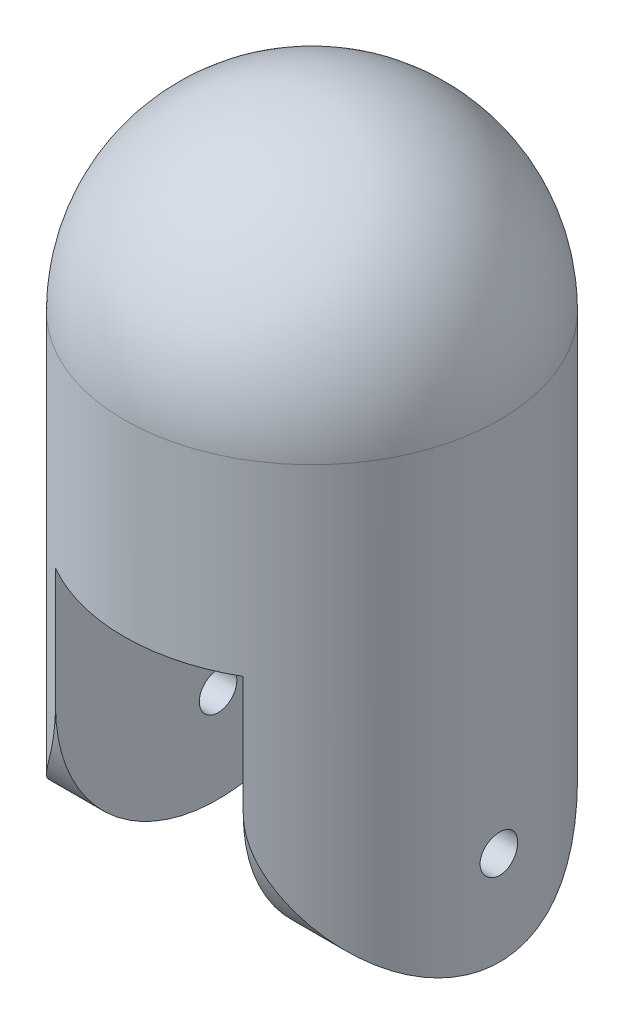
ISO-10303-21;
HEADER;
FILE_DESCRIPTION(('STEP AP214'),'2;1');
FILE_NAME('part.step','',(''),(''),'','','');
FILE_SCHEMA(('AUTOMOTIVE_DESIGN { 1 0 10303 214 1 1 1 1 }'));
ENDSEC;
DATA;
#1=APPLICATION_CONTEXT('core data for automotive mechanical design processes');
#2=APPLICATION_PROTOCOL_DEFINITION('international standard','automotive_design',2000,#1);
#3=PRODUCT_CONTEXT('',#1,'mechanical');
#4=PRODUCT('Part','Part','',(#3));
#5=PRODUCT_RELATED_PRODUCT_CATEGORY('part','',(#4));
#6=PRODUCT_DEFINITION_FORMATION('','',#4);
#7=PRODUCT_DEFINITION_CONTEXT('part definition',#1,'design');
#8=PRODUCT_DEFINITION('design','',#6,#7);
#9=PRODUCT_DEFINITION_SHAPE('','',#8);
#10=(LENGTH_UNIT() NAMED_UNIT(*) SI_UNIT(.MILLI.,.METRE.));
#11=(NAMED_UNIT(*) PLANE_ANGLE_UNIT() SI_UNIT($,.RADIAN.));
#12=(NAMED_UNIT(*) SI_UNIT($,.STERADIAN.) SOLID_ANGLE_UNIT());
#13=UNCERTAINTY_MEASURE_WITH_UNIT(LENGTH_MEASURE(1.E-05),#10,'distance_accuracy_value','');
#14=(GEOMETRIC_REPRESENTATION_CONTEXT(3) GLOBAL_UNCERTAINTY_ASSIGNED_CONTEXT((#13)) GLOBAL_UNIT_ASSIGNED_CONTEXT((#10,
#11,#12)) REPRESENTATION_CONTEXT('',''));
#15=CARTESIAN_POINT('',(0.,0.,0.));
#16=DIRECTION('',(0.,0.,1.));
#17=DIRECTION('',(1.,0.,0.));
#18=AXIS2_PLACEMENT_3D('',#15,#16,#17);
#19=CARTESIAN_POINT('',(0.,-5.,0.));
#20=DIRECTION('',(0.,1.,0.));
#21=DIRECTION('',(0.,0.,1.));
#22=AXIS2_PLACEMENT_3D('',#19,#20,#21);
#23=CYLINDRICAL_SURFACE('',#22,5.);
#24=CARTESIAN_POINT('',(-5.,-9.499999984,0.));
#25=CARTESIAN_POINT('',(-4.99999967760383,-9.50000119695261,-0.0280101777873308));
#26=CARTESIAN_POINT('',(-4.99976212796589,-9.50236161852776,-0.0560388743672643));
#27=CARTESIAN_POINT('',(-4.9988373378997,-9.51174216952627,-0.111319202789992));
#28=CARTESIAN_POINT('',(-4.99814960205238,-9.51876743261788,-0.138569943992334));
#29=CARTESIAN_POINT('',(-4.99640207258643,-9.53727110549382,-0.191485843816181));
#30=CARTESIAN_POINT('',(-4.99534250370722,-9.54874682581881,-0.217151949212178));
#31=CARTESIAN_POINT('',(-4.99296978652423,-9.57582044038433,-0.266188088942592));
#32=CARTESIAN_POINT('',(-4.99165668865977,-9.59141751491283,-0.289558578594351));
#33=CARTESIAN_POINT('',(-4.98891872100106,-9.62635133685349,-0.333429785940652));
#34=CARTESIAN_POINT('',(-4.98749350707263,-9.64569988833981,-0.353921083676557));
#35=CARTESIAN_POINT('',(-4.98469478355547,-9.68756225710439,-0.391371273173411));
#36=CARTESIAN_POINT('',(-4.98332127636073,-9.71007622071172,-0.408330001542547));
#37=CARTESIAN_POINT('',(-4.98077795653672,-9.75768925805425,-0.438266999185338));
#38=CARTESIAN_POINT('',(-4.97960858225206,-9.78279371506465,-0.451236747109148));
#39=CARTESIAN_POINT('',(-4.97761018630142,-9.83483778763942,-0.472773207447989));
#40=CARTESIAN_POINT('',(-4.97678115622644,-9.86177735784383,-0.481340028648987));
#41=CARTESIAN_POINT('',(-4.97556041880156,-9.9166308977411,-0.49379953655576));
#42=CARTESIAN_POINT('',(-4.97516725040178,-9.94454128662517,-0.497707842382945));
#43=CARTESIAN_POINT('',(-4.97485821369378,-10.0006244316877,-0.500787658550239));
#44=CARTESIAN_POINT('',(-4.9749423328401,-10.0287971809506,-0.499959293393249));
#45=CARTESIAN_POINT('',(-4.97557703293132,-10.0844976575086,-0.493602155885742));
#46=CARTESIAN_POINT('',(-4.97612592142474,-10.1120273531991,-0.488090437649585));
#47=CARTESIAN_POINT('',(-4.97762567000382,-10.1657689868394,-0.472549587176829));
#48=CARTESIAN_POINT('',(-4.97857653551958,-10.1919809069827,-0.462520393915724));
#49=CARTESIAN_POINT('',(-4.98077504602728,-10.2423968013225,-0.438210460966773));
#50=CARTESIAN_POINT('',(-4.98202321838719,-10.2665971031888,-0.423922154937144));
#51=CARTESIAN_POINT('',(-4.98467525767972,-10.3122626173566,-0.391505026234831));
#52=CARTESIAN_POINT('',(-4.98607912916871,-10.333727749577,-0.373376091156388));
#53=CARTESIAN_POINT('',(-4.98889192584952,-10.3734127088561,-0.333697066939875));
#54=CARTESIAN_POINT('',(-4.99030084603988,-10.3916178133905,-0.312132249473895));
#55=CARTESIAN_POINT('',(-4.99295914493806,-10.4241518299591,-0.266244749455726));
#56=CARTESIAN_POINT('',(-4.99420852346701,-10.4384807376475,-0.241922063811553));
#57=CARTESIAN_POINT('',(-4.99640737810265,-10.4628550249185,-0.191199059038273));
#58=CARTESIAN_POINT('',(-4.9973568019022,-10.4728996575013,-0.164798378542757));
#59=CARTESIAN_POINT('',(-4.9988482371317,-10.4884094739589,-0.110673612279845));
#60=CARTESIAN_POINT('',(-4.99939026074511,-10.4938747947803,-0.0829495661145428));
#61=CARTESIAN_POINT('',(-5.00000425834139,-10.5000521698624,-0.0270925504879768));
#62=CARTESIAN_POINT('',(-5.00007824134368,-10.5007845401513,0.00103815100607934));
#63=CARTESIAN_POINT('',(-4.99975320876917,-10.4975285844113,0.0570218983941149));
#64=CARTESIAN_POINT('',(-4.99935419958256,-10.4935403221585,0.0848749480340737));
#65=CARTESIAN_POINT('',(-4.99812930757904,-10.4809731677218,0.13945410777766));
#66=CARTESIAN_POINT('',(-4.99730430942121,-10.4724037879305,0.166182429695454));
#67=CARTESIAN_POINT('',(-4.99531999400854,-10.4509274274884,0.217822167543443));
#68=CARTESIAN_POINT('',(-4.99416066925831,-10.438020349588,0.242733542723093));
#69=CARTESIAN_POINT('',(-4.99163237612333,-10.4081845938476,0.290124099246603));
#70=CARTESIAN_POINT('',(-4.99026271740098,-10.3912425681866,0.312594839757218));
#71=CARTESIAN_POINT('',(-4.9874696635526,-10.3538369776062,0.354380822884648));
#72=CARTESIAN_POINT('',(-4.98604626707854,-10.3333733242988,0.373695986277013));
#73=CARTESIAN_POINT('',(-4.98330011964043,-10.2894167221159,0.408693067934103));
#74=CARTESIAN_POINT('',(-4.98197774954588,-10.2659131304273,0.424361652843407));
#75=CARTESIAN_POINT('',(-4.97958916100022,-10.2165963270549,0.451529143768985));
#76=CARTESIAN_POINT('',(-4.97852293904639,-10.1907831469605,0.463028106804347));
#77=CARTESIAN_POINT('',(-4.9767697366816,-10.1376256348755,0.481507619734649));
#78=CARTESIAN_POINT('',(-4.97608209071493,-10.1102840836903,0.48849610303374));
#79=CARTESIAN_POINT('',(-4.97516182481883,-10.0548084029826,0.497782019513339));
#80=CARTESIAN_POINT('',(-4.97492919183919,-10.0266742962148,0.500079587233779));
#81=CARTESIAN_POINT('',(-4.97494556392478,-9.97054465509411,0.499916585287808));
#82=CARTESIAN_POINT('',(-4.97519244883662,-9.94254905694121,0.497476960783508));
#83=CARTESIAN_POINT('',(-4.97613551790737,-9.88736753804265,0.487952742191796));
#84=CARTESIAN_POINT('',(-4.97683170257167,-9.86018161820781,0.480868142879295));
#85=CARTESIAN_POINT('',(-4.97859433992977,-9.8073913195536,0.462260858083581));
#86=CARTESIAN_POINT('',(-4.97966074138294,-9.78178672244534,0.450738786753755));
#87=CARTESIAN_POINT('',(-4.98204375802884,-9.73287154586025,0.42358579120604));
#88=CARTESIAN_POINT('',(-4.9833603718204,-9.70956095353834,0.40795488999697));
#89=CARTESIAN_POINT('',(-4.98610243513916,-9.6657881522995,0.372949290325798));
#90=CARTESIAN_POINT('',(-4.98752832281589,-9.64533845068704,0.353558986021871));
#91=CARTESIAN_POINT('',(-4.99032427300597,-9.60797387130152,0.31161585987346));
#92=CARTESIAN_POINT('',(-4.99169432206538,-9.59105984141843,0.289062281605575));
#93=CARTESIAN_POINT('',(-4.99422780996069,-9.56121325918389,0.241370725124351));
#94=CARTESIAN_POINT('',(-4.99539071982482,-9.54829084020802,0.216226381918243));
#95=CARTESIAN_POINT('',(-4.99737314607036,-9.5268687735485,0.164129145135606));
#96=CARTESIAN_POINT('',(-4.99819304942341,-9.51836413919394,0.137178329637511));
#97=CARTESIAN_POINT('',(-4.99919106881191,-9.50813967576056,0.0917291339200233));
#98=CARTESIAN_POINT('',(-4.99949300342359,-9.50509146203848,0.0735212790016357));
#99=CARTESIAN_POINT('',(-4.99989757474674,-9.501021221005,0.0368782917031077));
#100=CARTESIAN_POINT('',(-5.00000021228013,-9.49999918533747,0.01844316026059));
#101=CARTESIAN_POINT('',(-5.,-9.499999984,0.));
#102=B_SPLINE_CURVE_WITH_KNOTS('',3,(#24,#25,#26,#27,#28,#29,#30,#31,#32,#33,#34,#35,#36,#37,
#38,#39,#40,#41,#42,#43,#44,#45,#46,#47,#48,#49,#50,#51,#52,#53,#54,#55,#56,#57,#58,#59,#60,#61,
#62,#63,#64,#65,#66,#67,#68,#69,#70,#71,#72,#73,#74,#75,#76,#77,#78,#79,#80,#81,#82,#83,#84,#85,
#86,#87,#88,#89,#90,#91,#92,#93,#94,#95,#96,#97,#98,#99,#100,#101),.UNSPECIFIED.,.T.,.F.,(4,2,2,
2,2,2,2,2,2,2,2,2,2,2,2,2,2,2,2,2,2,2,2,2,2,2,2,2,2,2,2,2,2,2,2,2,2,2,4),(0.,0.0839631858065279,
0.168018926764722,0.252023950885486,0.336012279482916,0.420269297700153,0.504530212189535,
0.58896989616187,0.673407493727842,0.757561184428689,0.841712663168769,0.925559016753212,
1.0094065030137,1.09340384174215,1.17740363920568,1.26177371123901,1.34614387786477,
1.43052874914338,1.51491109676199,1.59893099409825,1.68294975632974,1.76679473286328,
1.85064158929701,1.93476976547761,2.01890005346993,2.10333328517581,2.18776536222363,
2.27204852551201,2.35632927144491,2.44023822438076,2.52414727170516,2.60804471005106,
2.69194167859412,2.77619467573449,2.86046785447851,2.94495324914103,3.02934307069971,
3.08462843482523,3.13991357094885),.UNSPECIFIED.);
#103=CARTESIAN_POINT('',(-5.,-9.499999984,0.));
#104=VERTEX_POINT('',#103);
#105=EDGE_CURVE('E150',#104,#104,#102,.T.);
#106=ORIENTED_EDGE('',*,*,#105,.F.);
#107=EDGE_LOOP('',(#106));
#108=FACE_BOUND('',#107,.T.);
#109=CARTESIAN_POINT('',(5.,-9.49999998400001,0.));
#110=CARTESIAN_POINT('',(4.99999967760383,-9.50000119694785,0.028010177787309));
#111=CARTESIAN_POINT('',(4.99976212796589,-9.50236161851822,0.0560388743676223));
#112=CARTESIAN_POINT('',(4.99883733789966,-9.5117421695073,0.111319202791904));
#113=CARTESIAN_POINT('',(4.99814960205231,-9.51876743259426,0.13856994399542));
#114=CARTESIAN_POINT('',(4.9964020725862,-9.53727110546116,0.191485843822376));
#115=CARTESIAN_POINT('',(4.99534250370688,-9.54874682578176,0.217151949220307));
#116=CARTESIAN_POINT('',(4.99296978652356,-9.57582044033887,0.266188088955293));
#117=CARTESIAN_POINT('',(4.9916566886589,-9.59141751486337,0.289558578609689));
#118=CARTESIAN_POINT('',(4.98891872099965,-9.62635133679649,0.333429785961909));
#119=CARTESIAN_POINT('',(4.9874935070709,-9.64569988827927,0.353921083701098));
#120=CARTESIAN_POINT('',(4.98469478355299,-9.68756225703739,0.391371273205068));
#121=CARTESIAN_POINT('',(4.98332127635783,-9.71007622064179,0.408330001578035));
#122=CARTESIAN_POINT('',(4.9807779565329,-9.75768925797917,0.438266999228974));
#123=CARTESIAN_POINT('',(4.97960858224772,-9.78279371498737,0.451236747157092));
#124=CARTESIAN_POINT('',(4.97761018629602,-9.8348377875585,0.472773207504861));
#125=CARTESIAN_POINT('',(4.97678115622049,-9.86177735776146,0.481340028710478));
#126=CARTESIAN_POINT('',(4.97556041879453,-9.91663089765667,0.49379953662665));
#127=CARTESIAN_POINT('',(4.97516725039421,-9.94454128654012,0.497707842458612));
#128=CARTESIAN_POINT('',(4.9748582136852,-10.0006244316022,0.50078765863549));
#129=CARTESIAN_POINT('',(4.97494233283105,-10.0287971808653,0.499959293483306));
#130=CARTESIAN_POINT('',(4.97557703292144,-10.0844976574244,0.49360215598529));
#131=CARTESIAN_POINT('',(4.97612592141451,-10.1120273531158,0.488090437753832));
#132=CARTESIAN_POINT('',(4.97762566999304,-10.1657689867588,0.472549587290256));
#133=CARTESIAN_POINT('',(4.97857653550862,-10.1919809069038,0.462520394033632));
#134=CARTESIAN_POINT('',(4.98077504601613,-10.2423968012476,0.438210461093338));
#135=CARTESIAN_POINT('',(4.98202321837605,-10.2665971031162,0.423922155067895));
#136=CARTESIAN_POINT('',(4.98467525766882,-10.3122626172895,0.391505026373519));
#137=CARTESIAN_POINT('',(4.98607912915803,-10.3337277495129,0.373376091298826));
#138=CARTESIAN_POINT('',(4.98889192583951,-10.3734127087987,0.333697067089251));
#139=CARTESIAN_POINT('',(4.99030084603033,-10.3916178133367,0.312132249626447));
#140=CARTESIAN_POINT('',(4.99295914492961,-10.4241518299132,0.266244749613979));
#141=CARTESIAN_POINT('',(4.99420852345921,-10.4384807376057,0.241922063972332));
#142=CARTESIAN_POINT('',(4.99640737809632,-10.4628550248856,0.191199059203264));
#143=CARTESIAN_POINT('',(4.99735680189669,-10.4728996574728,0.164798378709426));
#144=CARTESIAN_POINT('',(4.99884823712795,-10.4884094739398,0.110673612449066));
#145=CARTESIAN_POINT('',(4.99939026074229,-10.493874794766,0.0829495662846378));
#146=CARTESIAN_POINT('',(5.00000425834046,-10.5000521698578,0.0270925506589711));
#147=CARTESIAN_POINT('',(5.00007824134372,-10.5007845401515,-0.00103815083505638));
#148=CARTESIAN_POINT('',(4.99975320877112,-10.497528584421,-0.0570218982238571));
#149=CARTESIAN_POINT('',(4.99935419958544,-10.493540322173,-0.0848749478646096));
#150=CARTESIAN_POINT('',(4.99812930758371,-10.4809731677456,-0.139454107610455));
#151=CARTESIAN_POINT('',(4.99730430942673,-10.4724037879588,-0.166182429529717));
#152=CARTESIAN_POINT('',(4.99531999401562,-10.4509274275255,-0.217822167381385));
#153=CARTESIAN_POINT('',(4.99416066926609,-10.4380203496294,-0.242733542563244));
#154=CARTESIAN_POINT('',(4.99163237613234,-10.4081845938972,-0.290124099091779));
#155=CARTESIAN_POINT('',(4.99026271741051,-10.39124256824,-0.312594839605218));
#156=CARTESIAN_POINT('',(4.98746966356297,-10.3538369776669,-0.354380822738911));
#157=CARTESIAN_POINT('',(4.98604626708922,-10.3333733243628,-0.373695986134715));
#158=CARTESIAN_POINT('',(4.9833001196515,-10.2894167221861,-0.408693067799255));
#159=CARTESIAN_POINT('',(4.98197774955703,-10.2659131305002,-0.424361652712564));
#160=CARTESIAN_POINT('',(4.97958916101133,-10.2165963271326,-0.451529143646564));
#161=CARTESIAN_POINT('',(4.97852293905738,-10.1907831470402,-0.463028106686343));
#162=CARTESIAN_POINT('',(4.97676973669214,-10.1376256349584,-0.481507619625801));
#163=CARTESIAN_POINT('',(4.97608209072515,-10.1102840837744,-0.488496102929612));
#164=CARTESIAN_POINT('',(4.97516182482829,-10.0548084030682,-0.49778201941877));
#165=CARTESIAN_POINT('',(4.97492919184821,-10.0266742963007,-0.500079587144049));
#166=CARTESIAN_POINT('',(4.97494556393283,-9.97054465517982,-0.499916585207711));
#167=CARTESIAN_POINT('',(4.97519244884415,-9.94254905702642,-0.497476960708201));
#168=CARTESIAN_POINT('',(4.97613551791382,-9.88736753812603,-0.487952742125896));
#169=CARTESIAN_POINT('',(4.97683170257759,-9.86018161828989,-0.480868142818013));
#170=CARTESIAN_POINT('',(4.97859433993462,-9.80739131963239,-0.46226085803126));
#171=CARTESIAN_POINT('',(4.97966074138727,-9.78178672252216,-0.45073878670579));
#172=CARTESIAN_POINT('',(4.9820437580322,-9.7328715459324,-0.423585791166389));
#173=CARTESIAN_POINT('',(4.98336037182332,-9.70956095360782,-0.407954889961277));
#174=CARTESIAN_POINT('',(4.98610243514126,-9.66578815236302,-0.372949290297571));
#175=CARTESIAN_POINT('',(4.98752832281763,-9.64533845074729,-0.353558985997156));
#176=CARTESIAN_POINT('',(4.9903242730071,-9.60797387135468,-0.311615859855182));
#177=CARTESIAN_POINT('',(4.99169432206625,-9.59105984146777,-0.289062281590221));
#178=CARTESIAN_POINT('',(4.99422780996117,-9.56121325922513,-0.241370725114151));
#179=CARTESIAN_POINT('',(4.99539071982516,-9.54829084024497,-0.216226381910268));
#180=CARTESIAN_POINT('',(4.99737314607049,-9.52686877357656,-0.16412914513133));
#181=CARTESIAN_POINT('',(4.99819304942348,-9.5183641392174,-0.137178329634712));
#182=CARTESIAN_POINT('',(4.99919106881193,-9.50813967577624,-0.0917291339189367));
#183=CARTESIAN_POINT('',(4.99949300342359,-9.50509146205104,-0.0735212790010095));
#184=CARTESIAN_POINT('',(4.99989757474674,-9.50102122101129,-0.0368782917030553));
#185=CARTESIAN_POINT('',(5.00000021228013,-9.49999918534062,-0.0184431602606509));
#186=CARTESIAN_POINT('',(5.,-9.49999998400001,0.));
#187=B_SPLINE_CURVE_WITH_KNOTS('',3,(#109,#110,#111,#112,#113,#114,#115,#116,#117,#118,#119,
#120,#121,#122,#123,#124,#125,#126,#127,#128,#129,#130,#131,#132,#133,#134,#135,#136,#137,#138,
#139,#140,#141,#142,#143,#144,#145,#146,#147,#148,#149,#150,#151,#152,#153,#154,#155,#156,#157,
#158,#159,#160,#161,#162,#163,#164,#165,#166,#167,#168,#169,#170,#171,#172,#173,#174,#175,#176,
#177,#178,#179,#180,#181,#182,#183,#184,#185,#186),.UNSPECIFIED.,.T.,.F.,(4,2,2,2,2,2,2,2,2,2,2,
2,2,2,2,2,2,2,2,2,2,2,2,2,2,2,2,2,2,2,2,2,2,2,2,2,2,2,4),(0.,0.0839631858064614,
0.168018926764588,0.252023950885285,0.336012279482648,0.420269297699834,0.504530212189164,
0.588969896161619,0.673407493727713,0.757561184428719,0.84171266316896,0.925559016753315,
1.00940650301372,1.09340384174188,1.17740363920514,1.26177371123836,1.34614387786403,
1.4305287491429,1.51491109676176,1.59893099409831,1.68294975633009,1.76679473286358,
1.85064158929725,1.93476976547752,2.0189000534695,2.10333328517521,2.18776536222286,
2.27204852551143,2.35632927144451,2.44023822438061,2.52414727170527,2.60804471005117,
2.69194167859423,2.77619467573442,2.86046785447826,2.94495324914071,3.02934307069931,
3.08462843482502,3.13991357094882),.UNSPECIFIED.);
#188=CARTESIAN_POINT('',(5.,-9.49999998400001,0.));
#189=VERTEX_POINT('',#188);
#190=EDGE_CURVE('E11',#189,#189,#187,.T.);
#191=ORIENTED_EDGE('',*,*,#190,.F.);
#192=EDGE_LOOP('',(#191));
#193=FACE_BOUND('',#192,.T.);
#194=CARTESIAN_POINT('',(0.,0.,0.));
#195=DIRECTION('',(0.,1.,0.));
#196=DIRECTION('',(0.,0.,1.));
#197=AXIS2_PLACEMENT_3D('',#194,#195,#196);
#198=CIRCLE('',#197,5.);
#199=CARTESIAN_POINT('',(0.,0.,5.));
#200=VERTEX_POINT('',#199);
#201=EDGE_CURVE('E112',#200,#200,#198,.T.);
#202=ORIENTED_EDGE('',*,*,#201,.F.);
#203=EDGE_LOOP('',(#202));
#204=FACE_BOUND('',#203,.T.);
#205=DIRECTION('',(0.,1.,0.));
#206=VECTOR('',#205,1.);
#207=CARTESIAN_POINT('',(2.5,-12.5,4.33012701892219));
#208=LINE('',#207,#206);
#209=CARTESIAN_POINT('',(2.5,-8.16987298,4.33012701892219));
#210=VERTEX_POINT('',#209);
#211=CARTESIAN_POINT('',(2.5,-5.,4.33012701892219));
#212=VERTEX_POINT('',#211);
#213=EDGE_CURVE('E87',#210,#212,#208,.T.);
#214=ORIENTED_EDGE('',*,*,#213,.F.);
#215=CARTESIAN_POINT('',(2.49999999906659,-8.16987298,4.3301270194611));
#216=CARTESIAN_POINT('',(2.49994047676743,-8.24194984829454,4.33014457822797));
#217=CARTESIAN_POINT('',(2.50311561937887,-8.31398779937124,4.32832823331433));
#218=CARTESIAN_POINT('',(2.51546535484218,-8.45721545042402,4.32117145374343));
#219=CARTESIAN_POINT('',(2.52462657068261,-8.52840668222383,4.31583887652921));
#220=CARTESIAN_POINT('',(2.5482891498408,-8.66835404549736,4.30190598866757));
#221=CARTESIAN_POINT('',(2.56270159276735,-8.7371309423001,4.29336001828221));
#222=CARTESIAN_POINT('',(2.59618858709095,-8.8731062089166,4.27319425720397));
#223=CARTESIAN_POINT('',(2.61526607405113,-8.94030355547086,4.26157253065557));
#224=CARTESIAN_POINT('',(2.66661090607636,-9.10208619002003,4.2297107057759));
#225=CARTESIAN_POINT('',(2.70098677551673,-9.19569856703143,4.20792921130582));
#226=CARTESIAN_POINT('',(2.77578200963937,-9.37899623748519,4.1589700766128));
#227=CARTESIAN_POINT('',(2.81620416646853,-9.4686796917004,4.13178994141162));
#228=CARTESIAN_POINT('',(2.90173414609671,-9.64501994936612,4.07218358668973));
#229=CARTESIAN_POINT('',(2.94688018337797,-9.73164304457761,4.03971317338206));
#230=CARTESIAN_POINT('',(3.04018527207512,-9.90127050564764,3.96997141736602));
#231=CARTESIAN_POINT('',(3.08834536911603,-9.98427359853477,3.93269840375826));
#232=CARTESIAN_POINT('',(3.2136242521856,-10.191631929603,3.83173136117012));
#233=CARTESIAN_POINT('',(3.29209172473572,-10.3136012780895,3.76478703107732));
#234=CARTESIAN_POINT('',(3.45062090790724,-10.5498791605695,3.62005056916052));
#235=CARTESIAN_POINT('',(3.53068340958946,-10.6641837640039,3.54225293369691));
#236=CARTESIAN_POINT('',(3.68991842733122,-10.8848895019841,3.37604954681053));
#237=CARTESIAN_POINT('',(3.76909269304322,-10.9913100592037,3.28767137014388));
#238=CARTESIAN_POINT('',(3.92479506894187,-11.1961627177568,3.10013663379508));
#239=CARTESIAN_POINT('',(4.00132430741555,-11.2945982500087,3.00098474654639));
#240=CARTESIAN_POINT('',(4.19070323149422,-11.5343956795853,2.73448237828138));
#241=CARTESIAN_POINT('',(4.3005459079051,-11.669818214499,2.55947406994844));
#242=CARTESIAN_POINT('',(4.50290573310043,-11.9156686283318,2.18386224322196));
#243=CARTESIAN_POINT('',(4.59544717846934,-12.0261316048339,1.98329529382542));
#244=CARTESIAN_POINT('',(4.74138567039349,-12.1988245096879,1.59795256856209));
#245=CARTESIAN_POINT('',(4.79885307118405,-12.2661907785049,1.41707154388228));
#246=CARTESIAN_POINT('',(4.87002602166969,-12.3492690174862,1.13674457308049));
#247=CARTESIAN_POINT('',(4.89124912411256,-12.3739705561472,1.04177609700719));
#248=CARTESIAN_POINT('',(4.9282967002441,-12.4170167454456,0.849392805572188));
#249=CARTESIAN_POINT('',(4.94412342752523,-12.4353640497399,0.751979029689873));
#250=CARTESIAN_POINT('',(4.97012136582094,-12.4654712007516,0.554830254812794));
#251=CARTESIAN_POINT('',(4.98026080236174,-12.4771940397311,0.455085395154975));
#252=CARTESIAN_POINT('',(4.99452232871522,-12.4936757480599,0.254633908417356));
#253=CARTESIAN_POINT('',(4.99864694547929,-12.4984375418915,0.153927703127934));
#254=CARTESIAN_POINT('',(5.00078831372145,-12.5009103443902,-0.0476521363606335));
#255=CARTESIAN_POINT('',(4.99880447359667,-12.4986206701239,-0.148525785831074));
#256=CARTESIAN_POINT('',(4.9887844635487,-12.487045298542,-0.349537684631258));
#257=CARTESIAN_POINT('',(4.98074858701351,-12.47775994036,-0.449675969372087));
#258=CARTESIAN_POINT('',(4.9495794655057,-12.4416979081238,-0.731626940135232));
#259=CARTESIAN_POINT('',(4.91944088493083,-12.4067877835579,-0.911724008077016));
#260=CARTESIAN_POINT('',(4.84137866959759,-12.3158931274376,-1.26230489309132));
#261=CARTESIAN_POINT('',(4.79345186729009,-12.2599048424692,-1.43278699179388));
#262=CARTESIAN_POINT('',(4.67869812698035,-12.1248167034625,-1.77322781446586));
#263=CARTESIAN_POINT('',(4.61075471551269,-12.0443378964703,-1.94225644290029));
#264=CARTESIAN_POINT('',(4.46151274787863,-11.8654831594035,-2.26416283387372));
#265=CARTESIAN_POINT('',(4.38020558463961,-11.7670956906394,-2.41703008254082));
#266=CARTESIAN_POINT('',(4.22901619273311,-11.581140145929,-2.67050131277975));
#267=CARTESIAN_POINT('',(4.16119064126532,-11.4967945498685,-2.77475353364437));
#268=CARTESIAN_POINT('',(4.02152276571264,-11.320358199914,-2.9735680734887));
#269=CARTESIAN_POINT('',(3.94968017678608,-11.2282669351487,-3.0681297524078));
#270=CARTESIAN_POINT('',(3.80329664949956,-11.0367342725299,-3.24783022538312));
#271=CARTESIAN_POINT('',(3.72874920657812,-10.9372744621964,-3.33294398936746));
#272=CARTESIAN_POINT('',(3.57872916385941,-10.7315652426584,-3.49353093391375));
#273=CARTESIAN_POINT('',(3.50325683375385,-10.6253177763339,-3.56900685480031));
#274=CARTESIAN_POINT('',(3.3665079296543,-10.4254653790546,-3.69781256519623));
#275=CARTESIAN_POINT('',(3.30508619635195,-10.3329573596489,-3.75269653040851));
#276=CARTESIAN_POINT('',(3.18408757378044,-10.1431367769381,-3.85589228640528));
#277=CARTESIAN_POINT('',(3.12451108257063,-10.0458231885514,-3.90420266664522));
#278=CARTESIAN_POINT('',(3.00896771623357,-9.84632508431195,-3.99392609139749));
#279=CARTESIAN_POINT('',(2.95299275149551,-9.74415245024495,-4.0353549497167));
#280=CARTESIAN_POINT('',(2.84671272182185,-9.53440000102583,-4.11101948616403));
#281=CARTESIAN_POINT('',(2.79640332931101,-9.42682440493877,-4.14526067201697));
#282=CARTESIAN_POINT('',(2.69614938985654,-9.18634637656135,-4.21129088440891));
#283=CARTESIAN_POINT('',(2.64783528186176,-9.05232413754953,-4.24158138319471));
#284=CARTESIAN_POINT('',(2.56938166309593,-8.77717182323781,-4.28957602103519));
#285=CARTESIAN_POINT('',(2.53915936593726,-8.6360773766221,-4.30733755909624));
#286=CARTESIAN_POINT('',(2.51394596140145,-8.43963129219447,-4.32205107561643));
#287=CARTESIAN_POINT('',(2.5087447787912,-8.38593979158951,-4.32506882937062));
#288=CARTESIAN_POINT('',(2.50176293093652,-8.27813247636233,-4.329110072715));
#289=CARTESIAN_POINT('',(2.49999046071765,-8.22401595479432,-4.33012878444335));
#290=CARTESIAN_POINT('',(2.49999999906659,-8.16987298,-4.3301270194611));
#291=B_SPLINE_CURVE_WITH_KNOTS('',3,(#215,#216,#217,#218,#219,#220,#221,#222,#223,#224,#225,
#226,#227,#228,#229,#230,#231,#232,#233,#234,#235,#236,#237,#238,#239,#240,#241,#242,#243,#244,
#245,#246,#247,#248,#249,#250,#251,#252,#253,#254,#255,#256,#257,#258,#259,#260,#261,#262,#263,
#264,#265,#266,#267,#268,#269,#270,#271,#272,#273,#274,#275,#276,#277,#278,#279,#280,#281,#282,
#283,#284,#285,#286,#287,#288,#289,#290),.UNSPECIFIED.,.F.,.F.,(4,2,2,2,2,2,2,2,2,2,2,2,2,2,2,2,
2,2,2,2,2,2,2,2,2,2,2,2,2,2,2,2,2,2,2,2,2,4),(0.,0.216075675484335,0.431670132885519,
0.643771740825636,0.856007162554137,1.16172100677638,1.46757646657033,1.776131992691,
2.08479516142266,2.56335357437948,3.04215554926408,3.51973578808778,3.99710972639266,
4.73536588925034,5.47257738090747,6.07401582352368,6.37488780560626,6.67563398552368,
6.97804408993682,7.2803271089121,7.5826394048603,7.88493704638697,8.43998784013743,
8.99513751925541,9.59044868534392,10.1861447815449,10.636413933083,11.0867128057703,
11.5381775196604,11.9895135815582,12.3608545739322,12.7322751225574,13.102829967,
13.4730998200127,13.9086976374649,14.3422866543768,14.5042411093527,14.6665821785449),.UNSPECIFIED.);
#292=CARTESIAN_POINT('',(2.5,-8.16987298,-4.3301270194611));
#293=VERTEX_POINT('',#292);
#294=EDGE_CURVE('E84',#210,#293,#291,.T.);
#295=ORIENTED_EDGE('',*,*,#294,.T.);
#296=DIRECTION('',(0.,1.,0.));
#297=VECTOR('',#296,1.);
#298=CARTESIAN_POINT('',(2.5,-12.5,-4.33012701892219));
#299=LINE('',#298,#297);
#300=CARTESIAN_POINT('',(2.5,-5.,-4.33012701892219));
#301=VERTEX_POINT('',#300);
#302=EDGE_CURVE('E58',#293,#301,#299,.T.);
#303=ORIENTED_EDGE('',*,*,#302,.T.);
#304=CARTESIAN_POINT('',(0.,-5.,0.));
#305=DIRECTION('',(0.,1.,0.));
#306=DIRECTION('',(0.,0.,1.));
#307=AXIS2_PLACEMENT_3D('',#304,#305,#306);
#308=CIRCLE('',#307,5.);
#309=CARTESIAN_POINT('',(-2.5,-5.,-4.33012701892219));
#310=VERTEX_POINT('',#309);
#311=EDGE_CURVE('E113',#301,#310,#308,.T.);
#312=ORIENTED_EDGE('',*,*,#311,.T.);
#313=DIRECTION('',(0.,1.,0.));
#314=VECTOR('',#313,1.);
#315=CARTESIAN_POINT('',(-2.5,-12.5,-4.33012701892219));
#316=LINE('',#315,#314);
#317=CARTESIAN_POINT('',(-2.5,-8.16987298,-4.3301270194611));
#318=VERTEX_POINT('',#317);
#319=EDGE_CURVE('E66',#318,#310,#316,.T.);
#320=ORIENTED_EDGE('',*,*,#319,.F.);
#321=CARTESIAN_POINT('',(-2.49999999906659,-8.16987298,-4.3301270194611));
#322=CARTESIAN_POINT('',(-2.49994047676743,-8.24194984829454,-4.33014457822797));
#323=CARTESIAN_POINT('',(-2.50311561937887,-8.31398779937124,-4.32832823331433));
#324=CARTESIAN_POINT('',(-2.51546535484218,-8.45721545042402,-4.32117145374343));
#325=CARTESIAN_POINT('',(-2.52462657068261,-8.52840668222383,-4.31583887652921));
#326=CARTESIAN_POINT('',(-2.5482891498408,-8.66835404549736,-4.30190598866757));
#327=CARTESIAN_POINT('',(-2.56270159276735,-8.7371309423001,-4.29336001828221));
#328=CARTESIAN_POINT('',(-2.59618858709095,-8.8731062089166,-4.27319425720397));
#329=CARTESIAN_POINT('',(-2.61526607405113,-8.94030355547086,-4.26157253065557));
#330=CARTESIAN_POINT('',(-2.66661090607636,-9.10208619002003,-4.2297107057759));
#331=CARTESIAN_POINT('',(-2.70098677551673,-9.19569856703143,-4.20792921130582));
#332=CARTESIAN_POINT('',(-2.77578200963937,-9.37899623748519,-4.1589700766128));
#333=CARTESIAN_POINT('',(-2.81620416646853,-9.4686796917004,-4.13178994141162));
#334=CARTESIAN_POINT('',(-2.90173414609671,-9.64501994936612,-4.07218358668973));
#335=CARTESIAN_POINT('',(-2.94688018337797,-9.73164304457761,-4.03971317338206));
#336=CARTESIAN_POINT('',(-3.04018527207512,-9.90127050564764,-3.96997141736602));
#337=CARTESIAN_POINT('',(-3.08834536911603,-9.98427359853477,-3.93269840375826));
#338=CARTESIAN_POINT('',(-3.2136242521856,-10.191631929603,-3.83173136117012));
#339=CARTESIAN_POINT('',(-3.29209172473572,-10.3136012780895,-3.76478703107732));
#340=CARTESIAN_POINT('',(-3.45062090790724,-10.5498791605695,-3.62005056916052));
#341=CARTESIAN_POINT('',(-3.53068340958946,-10.6641837640039,-3.54225293369691));
#342=CARTESIAN_POINT('',(-3.68991842733122,-10.8848895019841,-3.37604954681053));
#343=CARTESIAN_POINT('',(-3.76909269304322,-10.9913100592037,-3.28767137014388));
#344=CARTESIAN_POINT('',(-3.92479506894187,-11.1961627177568,-3.10013663379508));
#345=CARTESIAN_POINT('',(-4.00132430741555,-11.2945982500087,-3.00098474654639));
#346=CARTESIAN_POINT('',(-4.19070323149422,-11.5343956795853,-2.73448237828138));
#347=CARTESIAN_POINT('',(-4.3005459079051,-11.669818214499,-2.55947406994844));
#348=CARTESIAN_POINT('',(-4.50290573310043,-11.9156686283318,-2.18386224322196));
#349=CARTESIAN_POINT('',(-4.59544717846934,-12.0261316048339,-1.98329529382542));
#350=CARTESIAN_POINT('',(-4.74138567039349,-12.1988245096879,-1.59795256856209));
#351=CARTESIAN_POINT('',(-4.79885307118405,-12.2661907785049,-1.41707154388228));
#352=CARTESIAN_POINT('',(-4.87002602166969,-12.3492690174862,-1.13674457308049));
#353=CARTESIAN_POINT('',(-4.89124912411256,-12.3739705561472,-1.04177609700719));
#354=CARTESIAN_POINT('',(-4.9282967002441,-12.4170167454456,-0.849392805572188));
#355=CARTESIAN_POINT('',(-4.94412342752523,-12.4353640497399,-0.751979029689873));
#356=CARTESIAN_POINT('',(-4.97012136582094,-12.4654712007516,-0.554830254812794));
#357=CARTESIAN_POINT('',(-4.98026080236174,-12.4771940397311,-0.455085395154975));
#358=CARTESIAN_POINT('',(-4.99452232871522,-12.4936757480599,-0.254633908417356));
#359=CARTESIAN_POINT('',(-4.99864694547929,-12.4984375418915,-0.153927703127934));
#360=CARTESIAN_POINT('',(-5.00078831372145,-12.5009103443902,0.0476521363606335));
#361=CARTESIAN_POINT('',(-4.99880447359667,-12.4986206701239,0.148525785831074));
#362=CARTESIAN_POINT('',(-4.9887844635487,-12.487045298542,0.349537684631258));
#363=CARTESIAN_POINT('',(-4.98074858701351,-12.47775994036,0.449675969372087));
#364=CARTESIAN_POINT('',(-4.9495794655057,-12.4416979081238,0.731626940135232));
#365=CARTESIAN_POINT('',(-4.91944088493083,-12.4067877835579,0.911724008077016));
#366=CARTESIAN_POINT('',(-4.84137866959759,-12.3158931274376,1.26230489309132));
#367=CARTESIAN_POINT('',(-4.79345186729009,-12.2599048424692,1.43278699179388));
#368=CARTESIAN_POINT('',(-4.67869812698035,-12.1248167034625,1.77322781446586));
#369=CARTESIAN_POINT('',(-4.61075471551269,-12.0443378964703,1.94225644290029));
#370=CARTESIAN_POINT('',(-4.46151274787863,-11.8654831594035,2.26416283387372));
#371=CARTESIAN_POINT('',(-4.38020558463961,-11.7670956906394,2.41703008254082));
#372=CARTESIAN_POINT('',(-4.22901619273311,-11.581140145929,2.67050131277975));
#373=CARTESIAN_POINT('',(-4.16119064126532,-11.4967945498685,2.77475353364437));
#374=CARTESIAN_POINT('',(-4.02152276571264,-11.320358199914,2.9735680734887));
#375=CARTESIAN_POINT('',(-3.94968017678608,-11.2282669351487,3.0681297524078));
#376=CARTESIAN_POINT('',(-3.80329664949956,-11.0367342725299,3.24783022538312));
#377=CARTESIAN_POINT('',(-3.72874920657812,-10.9372744621964,3.33294398936746));
#378=CARTESIAN_POINT('',(-3.57872916385941,-10.7315652426584,3.49353093391375));
#379=CARTESIAN_POINT('',(-3.50325683375385,-10.6253177763339,3.56900685480031));
#380=CARTESIAN_POINT('',(-3.3665079296543,-10.4254653790546,3.69781256519623));
#381=CARTESIAN_POINT('',(-3.30508619635195,-10.3329573596489,3.75269653040851));
#382=CARTESIAN_POINT('',(-3.18408757378044,-10.1431367769381,3.85589228640528));
#383=CARTESIAN_POINT('',(-3.12451108257063,-10.0458231885514,3.90420266664522));
#384=CARTESIAN_POINT('',(-3.00896771623357,-9.84632508431195,3.99392609139749));
#385=CARTESIAN_POINT('',(-2.95299275149551,-9.74415245024495,4.0353549497167));
#386=CARTESIAN_POINT('',(-2.84671272182185,-9.53440000102583,4.11101948616403));
#387=CARTESIAN_POINT('',(-2.79640332931101,-9.42682440493877,4.14526067201697));
#388=CARTESIAN_POINT('',(-2.69614938985654,-9.18634637656135,4.21129088440891));
#389=CARTESIAN_POINT('',(-2.64783528186176,-9.05232413754953,4.24158138319471));
#390=CARTESIAN_POINT('',(-2.56938166309593,-8.77717182323781,4.28957602103519));
#391=CARTESIAN_POINT('',(-2.53915936593726,-8.6360773766221,4.30733755909624));
#392=CARTESIAN_POINT('',(-2.51394596140145,-8.43963129219447,4.32205107561643));
#393=CARTESIAN_POINT('',(-2.5087447787912,-8.38593979158951,4.32506882937062));
#394=CARTESIAN_POINT('',(-2.50176293093652,-8.27813247636233,4.329110072715));
#395=CARTESIAN_POINT('',(-2.49999046071765,-8.22401595479432,4.33012878444335));
#396=CARTESIAN_POINT('',(-2.49999999906659,-8.16987298,4.3301270194611));
#397=B_SPLINE_CURVE_WITH_KNOTS('',3,(#321,#322,#323,#324,#325,#326,#327,#328,#329,#330,#331,
#332,#333,#334,#335,#336,#337,#338,#339,#340,#341,#342,#343,#344,#345,#346,#347,#348,#349,#350,
#351,#352,#353,#354,#355,#356,#357,#358,#359,#360,#361,#362,#363,#364,#365,#366,#367,#368,#369,
#370,#371,#372,#373,#374,#375,#376,#377,#378,#379,#380,#381,#382,#383,#384,#385,#386,#387,#388,
#389,#390,#391,#392,#393,#394,#395,#396),.UNSPECIFIED.,.F.,.F.,(4,2,2,2,2,2,2,2,2,2,2,2,2,2,2,2,
2,2,2,2,2,2,2,2,2,2,2,2,2,2,2,2,2,2,2,2,2,4),(0.,0.216075675484335,0.431670132885519,
0.643771740825636,0.856007162554137,1.16172100677638,1.46757646657033,1.776131992691,
2.08479516142266,2.56335357437948,3.04215554926408,3.51973578808778,3.99710972639266,
4.73536588925034,5.47257738090747,6.07401582352368,6.37488780560626,6.67563398552368,
6.97804408993682,7.2803271089121,7.5826394048603,7.88493704638697,8.43998784013743,
8.99513751925541,9.59044868534392,10.1861447815449,10.636413933083,11.0867128057703,
11.5381775196604,11.9895135815582,12.3608545739322,12.7322751225574,13.102829967,
13.4730998200127,13.9086976374649,14.3422866543768,14.5042411093527,14.6665821785449),.UNSPECIFIED.);
#398=CARTESIAN_POINT('',(-2.5,-8.16987298,4.33012701892219));
#399=VERTEX_POINT('',#398);
#400=EDGE_CURVE('E95',#318,#399,#397,.T.);
#401=ORIENTED_EDGE('',*,*,#400,.T.);
#402=DIRECTION('',(0.,1.,0.));
#403=VECTOR('',#402,1.);
#404=CARTESIAN_POINT('',(-2.5,-12.5,4.33012701892219));
#405=LINE('',#404,#403);
#406=CARTESIAN_POINT('',(-2.5,-5.,4.33012701892219));
#407=VERTEX_POINT('',#406);
#408=EDGE_CURVE('E109',#399,#407,#405,.T.);
#409=ORIENTED_EDGE('',*,*,#408,.T.);
#410=EDGE_CURVE('E51',#407,#212,#308,.T.);
#411=ORIENTED_EDGE('',*,*,#410,.T.);
#412=EDGE_LOOP('',(#214,#295,#303,#312,#320,#401,#409,#411));
#413=FACE_BOUND('',#412,.T.);
#414=ADVANCED_FACE('F39',(#108,#193,#204,#413),#23,.T.);
#415=CARTESIAN_POINT('',(-2.5,-12.5,4.33012701892219));
#416=DIRECTION('',(-1.,0.,0.));
#417=DIRECTION('',(0.,0.,1.));
#418=AXIS2_PLACEMENT_3D('',#415,#416,#417);
#419=PLANE('',#418);
#420=CARTESIAN_POINT('',(-2.5,-10.,4.25735835474228E-11));
#421=DIRECTION('',(-1.,0.,0.));
#422=DIRECTION('',(0.,0.,1.));
#423=AXIS2_PLACEMENT_3D('',#420,#421,#422);
#424=CIRCLE('',#423,0.500000015999999);
#425=CARTESIAN_POINT('',(-2.5,-10.,0.500000016042572));
#426=VERTEX_POINT('',#425);
#427=EDGE_CURVE('E147',#426,#426,#424,.T.);
#428=ORIENTED_EDGE('',*,*,#427,.T.);
#429=EDGE_LOOP('',(#428));
#430=FACE_BOUND('',#429,.T.);
#431=CARTESIAN_POINT('',(-2.5,-8.16987298,0.));
#432=DIRECTION('',(-1.,0.,0.));
#433=DIRECTION('',(0.,0.,1.));
#434=AXIS2_PLACEMENT_3D('',#431,#432,#433);
#435=CIRCLE('',#434,4.3301270194611);
#436=EDGE_CURVE('E104',#318,#399,#435,.T.);
#437=ORIENTED_EDGE('',*,*,#436,.F.);
#438=ORIENTED_EDGE('',*,*,#319,.T.);
#439=DIRECTION('',(0.,0.,1.));
#440=VECTOR('',#439,1.);
#441=CARTESIAN_POINT('',(-2.5,-5.,4.33012701892219));
#442=LINE('',#441,#440);
#443=EDGE_CURVE('E102',#310,#407,#442,.T.);
#444=ORIENTED_EDGE('',*,*,#443,.T.);
#445=ORIENTED_EDGE('',*,*,#408,.F.);
#446=EDGE_LOOP('',(#437,#438,#444,#445));
#447=FACE_BOUND('',#446,.T.);
#448=ADVANCED_FACE('F123',(#430,#447),#419,.F.);
#449=CARTESIAN_POINT('',(2.5,-12.5,4.33012701892219));
#450=DIRECTION('',(1.,0.,0.));
#451=DIRECTION('',(0.,0.,-1.));
#452=AXIS2_PLACEMENT_3D('',#449,#450,#451);
#453=PLANE('',#452);
#454=CARTESIAN_POINT('',(2.5,-10.,4.25735835474228E-11));
#455=DIRECTION('',(-1.,0.,0.));
#456=DIRECTION('',(0.,0.,1.));
#457=AXIS2_PLACEMENT_3D('',#454,#455,#456);
#458=CIRCLE('',#457,0.500000015999988);
#459=CARTESIAN_POINT('',(2.5,-10.,0.500000016042562));
#460=VERTEX_POINT('',#459);
#461=EDGE_CURVE('E91',#460,#460,#458,.T.);
#462=ORIENTED_EDGE('',*,*,#461,.F.);
#463=EDGE_LOOP('',(#462));
#464=FACE_BOUND('',#463,.T.);
#465=CARTESIAN_POINT('',(2.5,-8.16987298,0.));
#466=DIRECTION('',(1.,0.,0.));
#467=DIRECTION('',(0.,0.,-1.));
#468=AXIS2_PLACEMENT_3D('',#465,#466,#467);
#469=CIRCLE('',#468,4.3301270194611);
#470=EDGE_CURVE('E90',#210,#293,#469,.T.);
#471=ORIENTED_EDGE('',*,*,#470,.F.);
#472=ORIENTED_EDGE('',*,*,#213,.T.);
#473=DIRECTION('',(0.,0.,-1.));
#474=VECTOR('',#473,1.);
#475=CARTESIAN_POINT('',(2.5,-5.,4.33012701892219));
#476=LINE('',#475,#474);
#477=EDGE_CURVE('E99',#212,#301,#476,.T.);
#478=ORIENTED_EDGE('',*,*,#477,.T.);
#479=ORIENTED_EDGE('',*,*,#302,.F.);
#480=EDGE_LOOP('',(#471,#472,#478,#479));
#481=FACE_BOUND('',#480,.T.);
#482=ADVANCED_FACE('F97',(#464,#481),#453,.F.);
#483=CARTESIAN_POINT('',(0.,-5.,0.));
#484=DIRECTION('',(0.,1.,0.));
#485=DIRECTION('',(0.,0.,1.));
#486=AXIS2_PLACEMENT_3D('',#483,#484,#485);
#487=PLANE('',#486);
#488=ORIENTED_EDGE('',*,*,#477,.F.);
#489=ORIENTED_EDGE('',*,*,#410,.F.);
#490=ORIENTED_EDGE('',*,*,#443,.F.);
#491=ORIENTED_EDGE('',*,*,#311,.F.);
#492=EDGE_LOOP('',(#488,#489,#490,#491));
#493=FACE_BOUND('',#492,.T.);
#494=ADVANCED_FACE('F121',(#493),#487,.F.);
#495=CARTESIAN_POINT('',(5.,-8.16987298,0.));
#496=DIRECTION('',(-1.,0.,0.));
#497=DIRECTION('',(0.,0.,1.));
#498=AXIS2_PLACEMENT_3D('',#495,#496,#497);
#499=CYLINDRICAL_SURFACE('',#498,4.3301270194611);
#500=ORIENTED_EDGE('',*,*,#470,.T.);
#501=ORIENTED_EDGE('',*,*,#294,.F.);
#502=EDGE_LOOP('',(#500,#501));
#503=FACE_BOUND('',#502,.T.);
#504=ADVANCED_FACE('F93',(#503),#499,.T.);
#505=ORIENTED_EDGE('',*,*,#436,.T.);
#506=ORIENTED_EDGE('',*,*,#400,.F.);
#507=EDGE_LOOP('',(#505,#506));
#508=FACE_BOUND('',#507,.T.);
#509=ADVANCED_FACE('F131',(#508),#499,.T.);
#510=CARTESIAN_POINT('',(2.5,-10.,4.25735835474228E-11));
#511=DIRECTION('',(-1.,0.,0.));
#512=DIRECTION('',(0.,0.,1.));
#513=AXIS2_PLACEMENT_3D('',#510,#511,#512);
#514=CYLINDRICAL_SURFACE('',#513,0.500000015999993);
#515=ORIENTED_EDGE('',*,*,#190,.T.);
#516=EDGE_LOOP('',(#515));
#517=FACE_BOUND('',#516,.T.);
#518=ORIENTED_EDGE('',*,*,#461,.T.);
#519=EDGE_LOOP('',(#518));
#520=FACE_BOUND('',#519,.T.);
#521=ADVANCED_FACE('F135',(#517,#520),#514,.F.);
#522=CARTESIAN_POINT('',(2.5,-10.,4.25735835474228E-11));
#523=DIRECTION('',(1.,0.,0.));
#524=DIRECTION('',(0.,0.,-1.));
#525=AXIS2_PLACEMENT_3D('',#522,#523,#524);
#526=CYLINDRICAL_SURFACE('',#525,0.500000015999999);
#527=ORIENTED_EDGE('',*,*,#105,.T.);
#528=EDGE_LOOP('',(#527));
#529=FACE_BOUND('',#528,.T.);
#530=ORIENTED_EDGE('',*,*,#427,.F.);
#531=EDGE_LOOP('',(#530));
#532=FACE_BOUND('',#531,.T.);
#533=ADVANCED_FACE('F155',(#529,#532),#526,.F.);
#534=CARTESIAN_POINT('',(0.,0.,0.));
#535=DIRECTION('',(0.,-1.,0.));
#536=DIRECTION('',(-1.,0.,0.));
#537=AXIS2_PLACEMENT_3D('',#534,#535,#536);
#538=SPHERICAL_SURFACE('',#537,5.);
#539=ORIENTED_EDGE('',*,*,#201,.T.);
#540=EDGE_LOOP('',(#539));
#541=FACE_BOUND('',#540,.T.);
#542=ADVANCED_FACE('F159',(#541),#538,.T.);
#543=CLOSED_SHELL('',(#414,#448,#482,#494,#504,#509,#521,#533,#542));
#544=MANIFOLD_SOLID_BREP('B2',#543);
#545=ADVANCED_BREP_SHAPE_REPRESENTATION('',(#18,#544),#14);
#546=SHAPE_DEFINITION_REPRESENTATION(#9,#545);
ENDSEC;
END-ISO-10303-21;
